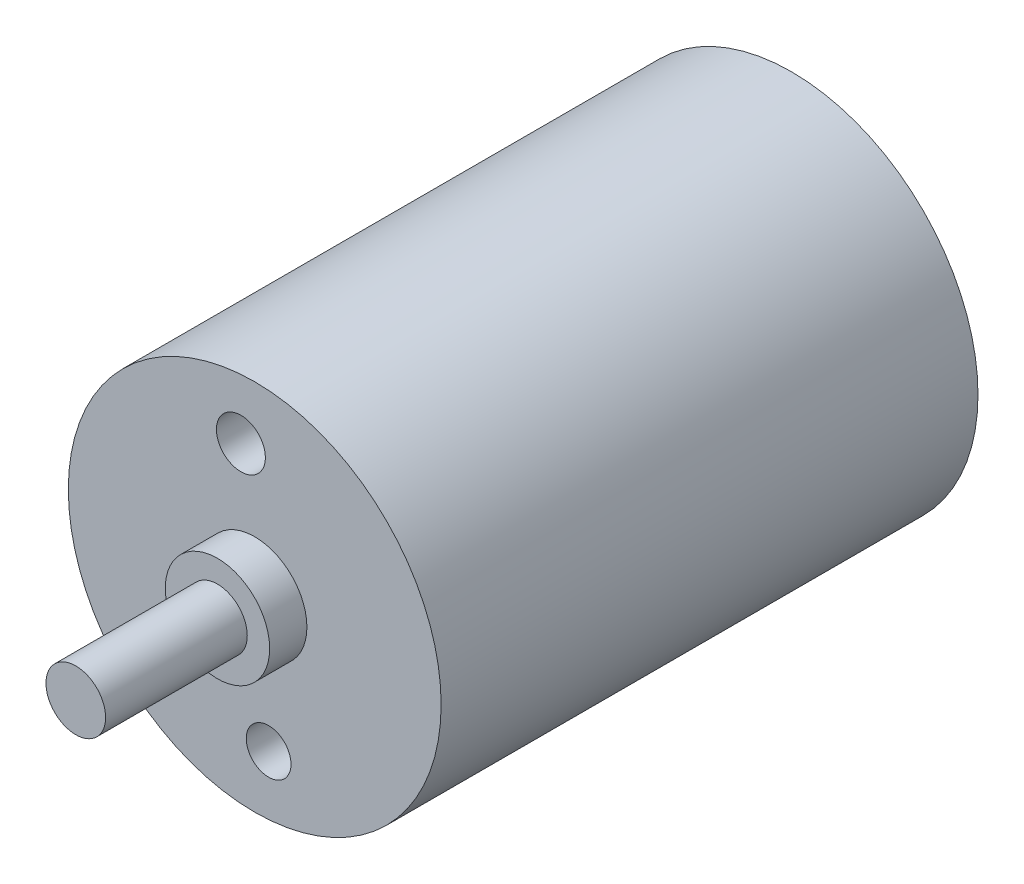
ISO-10303-21;
HEADER;
FILE_DESCRIPTION(('STEP AP214'),'2;1');
FILE_NAME('part.step','',(''),(''),'','','');
FILE_SCHEMA(('AUTOMOTIVE_DESIGN { 1 0 10303 214 1 1 1 1 }'));
ENDSEC;
DATA;
#1=APPLICATION_CONTEXT('core data for automotive mechanical design processes');
#2=APPLICATION_PROTOCOL_DEFINITION('international standard','automotive_design',2000,#1);
#3=PRODUCT_CONTEXT('',#1,'mechanical');
#4=PRODUCT('Part','Part','',(#3));
#5=PRODUCT_RELATED_PRODUCT_CATEGORY('part','',(#4));
#6=PRODUCT_DEFINITION_FORMATION('','',#4);
#7=PRODUCT_DEFINITION_CONTEXT('part definition',#1,'design');
#8=PRODUCT_DEFINITION('design','',#6,#7);
#9=PRODUCT_DEFINITION_SHAPE('','',#8);
#10=(LENGTH_UNIT() NAMED_UNIT(*) SI_UNIT(.MILLI.,.METRE.));
#11=(NAMED_UNIT(*) PLANE_ANGLE_UNIT() SI_UNIT($,.RADIAN.));
#12=(NAMED_UNIT(*) SI_UNIT($,.STERADIAN.) SOLID_ANGLE_UNIT());
#13=UNCERTAINTY_MEASURE_WITH_UNIT(LENGTH_MEASURE(1.E-05),#10,'distance_accuracy_value','');
#14=(GEOMETRIC_REPRESENTATION_CONTEXT(3) GLOBAL_UNCERTAINTY_ASSIGNED_CONTEXT((#13)) GLOBAL_UNIT_ASSIGNED_CONTEXT((#10,
#11,#12)) REPRESENTATION_CONTEXT('',''));
#15=CARTESIAN_POINT('',(0.,0.,0.));
#16=DIRECTION('',(0.,0.,1.));
#17=DIRECTION('',(1.,0.,0.));
#18=AXIS2_PLACEMENT_3D('',#15,#16,#17);
#19=CARTESIAN_POINT('',(-10.2159676414426,3.5755886745049,36.));
#20=DIRECTION('',(0.,0.,-1.));
#21=DIRECTION('',(-1.,0.,0.));
#22=AXIS2_PLACEMENT_3D('',#19,#20,#21);
#23=CYLINDRICAL_SURFACE('',#22,12.5);
#24=CARTESIAN_POINT('',(-10.2159676414426,3.5755886745049,36.));
#25=DIRECTION('',(0.,0.,1.));
#26=DIRECTION('',(1.,0.,0.));
#27=AXIS2_PLACEMENT_3D('',#24,#25,#26);
#28=CIRCLE('',#27,12.5);
#29=CARTESIAN_POINT('',(2.28403235855741,3.5755886745049,36.));
#30=VERTEX_POINT('',#29);
#31=EDGE_CURVE('E43',#30,#30,#28,.T.);
#32=ORIENTED_EDGE('',*,*,#31,.F.);
#33=EDGE_LOOP('',(#32));
#34=FACE_BOUND('',#33,.T.);
#35=CARTESIAN_POINT('',(-10.2159676414426,3.5755886745049,0.));
#36=DIRECTION('',(0.,0.,1.));
#37=DIRECTION('',(1.,0.,0.));
#38=AXIS2_PLACEMENT_3D('',#35,#36,#37);
#39=CIRCLE('',#38,12.5);
#40=CARTESIAN_POINT('',(2.28403235855741,3.5755886745049,0.));
#41=VERTEX_POINT('',#40);
#42=EDGE_CURVE('E34',#41,#41,#39,.T.);
#43=ORIENTED_EDGE('',*,*,#42,.T.);
#44=EDGE_LOOP('',(#43));
#45=FACE_BOUND('',#44,.T.);
#46=ADVANCED_FACE('F31',(#34,#45),#23,.T.);
#47=CARTESIAN_POINT('',(-10.2159676414426,3.5755886745049,36.));
#48=DIRECTION('',(0.,0.,1.));
#49=DIRECTION('',(1.,0.,0.));
#50=AXIS2_PLACEMENT_3D('',#47,#48,#49);
#51=PLANE('',#50);
#52=CARTESIAN_POINT('',(-11.1433319124449,12.0248487313897,36.));
#53=DIRECTION('',(0.,0.,1.));
#54=DIRECTION('',(1.,0.,0.));
#55=AXIS2_PLACEMENT_3D('',#52,#53,#54);
#56=CIRCLE('',#55,1.64118299360333);
#57=CARTESIAN_POINT('',(-9.5021489188416,12.0248487313897,36.));
#58=VERTEX_POINT('',#57);
#59=EDGE_CURVE('E171',#58,#58,#56,.T.);
#60=ORIENTED_EDGE('',*,*,#59,.F.);
#61=EDGE_LOOP('',(#60));
#62=FACE_BOUND('',#61,.T.);
#63=CARTESIAN_POINT('',(-9.28303431350024,-4.9244113254951,36.));
#64=DIRECTION('',(0.,0.,1.));
#65=DIRECTION('',(1.,0.,0.));
#66=AXIS2_PLACEMENT_3D('',#63,#64,#65);
#67=CIRCLE('',#66,1.5);
#68=CARTESIAN_POINT('',(-7.78303431350024,-4.9244113254951,36.));
#69=VERTEX_POINT('',#68);
#70=EDGE_CURVE('E179',#69,#69,#67,.T.);
#71=ORIENTED_EDGE('',*,*,#70,.F.);
#72=EDGE_LOOP('',(#71));
#73=FACE_BOUND('',#72,.T.);
#74=CARTESIAN_POINT('',(-10.2159676414426,3.5755886745049,36.));
#75=DIRECTION('',(0.,0.,1.));
#76=DIRECTION('',(1.,0.,0.));
#77=AXIS2_PLACEMENT_3D('',#74,#75,#76);
#78=CIRCLE('',#77,3.5);
#79=CARTESIAN_POINT('',(-6.71596764144259,3.5755886745049,36.));
#80=VERTEX_POINT('',#79);
#81=EDGE_CURVE('E38',#80,#80,#78,.T.);
#82=ORIENTED_EDGE('',*,*,#81,.F.);
#83=EDGE_LOOP('',(#82));
#84=FACE_BOUND('',#83,.T.);
#85=ORIENTED_EDGE('',*,*,#31,.T.);
#86=EDGE_LOOP('',(#85));
#87=FACE_BOUND('',#86,.T.);
#88=ADVANCED_FACE('F61',(#62,#73,#84,#87),#51,.T.);
#89=CARTESIAN_POINT('',(-10.2159676414426,3.5755886745049,0.));
#90=DIRECTION('',(0.,0.,1.));
#91=DIRECTION('',(1.,0.,0.));
#92=AXIS2_PLACEMENT_3D('',#89,#90,#91);
#93=PLANE('',#92);
#94=ORIENTED_EDGE('',*,*,#42,.F.);
#95=EDGE_LOOP('',(#94));
#96=FACE_BOUND('',#95,.T.);
#97=ADVANCED_FACE('F58',(#96),#93,.F.);
#98=CARTESIAN_POINT('',(-10.2159676414426,3.5755886745049,38.5));
#99=DIRECTION('',(0.,0.,-1.));
#100=DIRECTION('',(-1.,0.,0.));
#101=AXIS2_PLACEMENT_3D('',#98,#99,#100);
#102=CYLINDRICAL_SURFACE('',#101,3.5);
#103=CARTESIAN_POINT('',(-10.2159676414426,3.5755886745049,38.5));
#104=DIRECTION('',(0.,0.,1.));
#105=DIRECTION('',(1.,0.,0.));
#106=AXIS2_PLACEMENT_3D('',#103,#104,#105);
#107=CIRCLE('',#106,3.5);
#108=CARTESIAN_POINT('',(-6.71596764144259,3.5755886745049,38.5));
#109=VERTEX_POINT('',#108);
#110=EDGE_CURVE('E49',#109,#109,#107,.T.);
#111=ORIENTED_EDGE('',*,*,#110,.F.);
#112=EDGE_LOOP('',(#111));
#113=FACE_BOUND('',#112,.T.);
#114=ORIENTED_EDGE('',*,*,#81,.T.);
#115=EDGE_LOOP('',(#114));
#116=FACE_BOUND('',#115,.T.);
#117=ADVANCED_FACE('F60',(#113,#116),#102,.T.);
#118=CARTESIAN_POINT('',(-10.2159676414426,3.5755886745049,38.5));
#119=DIRECTION('',(0.,0.,1.));
#120=DIRECTION('',(1.,0.,0.));
#121=AXIS2_PLACEMENT_3D('',#118,#119,#120);
#122=PLANE('',#121);
#123=CARTESIAN_POINT('',(-10.2159676414426,3.5755886745049,38.5));
#124=DIRECTION('',(0.,0.,1.));
#125=DIRECTION('',(1.,0.,0.));
#126=AXIS2_PLACEMENT_3D('',#123,#124,#125);
#127=CIRCLE('',#126,2.);
#128=CARTESIAN_POINT('',(-8.21596764144259,3.5755886745049,38.5));
#129=VERTEX_POINT('',#128);
#130=EDGE_CURVE('E10',#129,#129,#127,.T.);
#131=ORIENTED_EDGE('',*,*,#130,.F.);
#132=EDGE_LOOP('',(#131));
#133=FACE_BOUND('',#132,.T.);
#134=ORIENTED_EDGE('',*,*,#110,.T.);
#135=EDGE_LOOP('',(#134));
#136=FACE_BOUND('',#135,.T.);
#137=ADVANCED_FACE('F66',(#133,#136),#122,.T.);
#138=CARTESIAN_POINT('',(-10.2159676414426,3.5755886745049,48.));
#139=DIRECTION('',(0.,0.,-1.));
#140=DIRECTION('',(-1.,0.,0.));
#141=AXIS2_PLACEMENT_3D('',#138,#139,#140);
#142=CYLINDRICAL_SURFACE('',#141,2.);
#143=CARTESIAN_POINT('',(-10.2159676414426,3.5755886745049,48.));
#144=DIRECTION('',(0.,0.,1.));
#145=DIRECTION('',(1.,0.,0.));
#146=AXIS2_PLACEMENT_3D('',#143,#144,#145);
#147=CIRCLE('',#146,2.);
#148=CARTESIAN_POINT('',(-8.21596764144259,3.5755886745049,48.));
#149=VERTEX_POINT('',#148);
#150=EDGE_CURVE('E47',#149,#149,#147,.T.);
#151=ORIENTED_EDGE('',*,*,#150,.F.);
#152=EDGE_LOOP('',(#151));
#153=FACE_BOUND('',#152,.T.);
#154=ORIENTED_EDGE('',*,*,#130,.T.);
#155=EDGE_LOOP('',(#154));
#156=FACE_BOUND('',#155,.T.);
#157=ADVANCED_FACE('F133',(#153,#156),#142,.T.);
#158=CARTESIAN_POINT('',(-10.2159676414426,3.5755886745049,48.));
#159=DIRECTION('',(0.,0.,1.));
#160=DIRECTION('',(1.,0.,0.));
#161=AXIS2_PLACEMENT_3D('',#158,#159,#160);
#162=PLANE('',#161);
#163=ORIENTED_EDGE('',*,*,#150,.T.);
#164=EDGE_LOOP('',(#163));
#165=FACE_BOUND('',#164,.T.);
#166=ADVANCED_FACE('F86',(#165),#162,.T.);
#167=CARTESIAN_POINT('',(-9.28303431350024,-4.9244113254951,31.));
#168=DIRECTION('',(0.,0.,1.));
#169=DIRECTION('',(1.,0.,0.));
#170=AXIS2_PLACEMENT_3D('',#167,#168,#169);
#171=CYLINDRICAL_SURFACE('',#170,1.5);
#172=CARTESIAN_POINT('',(-9.28303431350024,-4.9244113254951,31.));
#173=DIRECTION('',(0.,0.,1.));
#174=DIRECTION('',(1.,0.,0.));
#175=AXIS2_PLACEMENT_3D('',#172,#173,#174);
#176=CIRCLE('',#175,1.5);
#177=CARTESIAN_POINT('',(-7.78303431350024,-4.9244113254951,31.));
#178=VERTEX_POINT('',#177);
#179=EDGE_CURVE('E175',#178,#178,#176,.T.);
#180=ORIENTED_EDGE('',*,*,#179,.F.);
#181=EDGE_LOOP('',(#180));
#182=FACE_BOUND('',#181,.T.);
#183=ORIENTED_EDGE('',*,*,#70,.T.);
#184=EDGE_LOOP('',(#183));
#185=FACE_BOUND('',#184,.T.);
#186=ADVANCED_FACE('F91',(#182,#185),#171,.F.);
#187=CARTESIAN_POINT('',(-9.28303431350024,-4.9244113254951,31.));
#188=DIRECTION('',(0.,0.,1.));
#189=DIRECTION('',(1.,0.,0.));
#190=AXIS2_PLACEMENT_3D('',#187,#188,#189);
#191=PLANE('',#190);
#192=ORIENTED_EDGE('',*,*,#179,.T.);
#193=EDGE_LOOP('',(#192));
#194=FACE_BOUND('',#193,.T.);
#195=ADVANCED_FACE('F96',(#194),#191,.T.);
#196=CARTESIAN_POINT('',(-11.1433319124449,12.0248487313897,31.));
#197=DIRECTION('',(0.,0.,1.));
#198=DIRECTION('',(1.,0.,0.));
#199=AXIS2_PLACEMENT_3D('',#196,#197,#198);
#200=CYLINDRICAL_SURFACE('',#199,1.64118299360333);
#201=CARTESIAN_POINT('',(-11.1433319124449,12.0248487313897,31.));
#202=DIRECTION('',(0.,0.,1.));
#203=DIRECTION('',(1.,0.,0.));
#204=AXIS2_PLACEMENT_3D('',#201,#202,#203);
#205=CIRCLE('',#204,1.64118299360333);
#206=CARTESIAN_POINT('',(-9.5021489188416,12.0248487313897,31.));
#207=VERTEX_POINT('',#206);
#208=EDGE_CURVE('E170',#207,#207,#205,.T.);
#209=ORIENTED_EDGE('',*,*,#208,.F.);
#210=EDGE_LOOP('',(#209));
#211=FACE_BOUND('',#210,.T.);
#212=ORIENTED_EDGE('',*,*,#59,.T.);
#213=EDGE_LOOP('',(#212));
#214=FACE_BOUND('',#213,.T.);
#215=ADVANCED_FACE('F106',(#211,#214),#200,.F.);
#216=CARTESIAN_POINT('',(-11.1433319124449,12.0248487313897,31.));
#217=DIRECTION('',(0.,0.,1.));
#218=DIRECTION('',(1.,0.,0.));
#219=AXIS2_PLACEMENT_3D('',#216,#217,#218);
#220=PLANE('',#219);
#221=ORIENTED_EDGE('',*,*,#208,.T.);
#222=EDGE_LOOP('',(#221));
#223=FACE_BOUND('',#222,.T.);
#224=ADVANCED_FACE('F116',(#223),#220,.T.);
#225=CLOSED_SHELL('',(#46,#88,#97,#117,#137,#157,#166,#186,#195,#215,#224));
#226=MANIFOLD_SOLID_BREP('B2',#225);
#227=ADVANCED_BREP_SHAPE_REPRESENTATION('',(#18,#226),#14);
#228=SHAPE_DEFINITION_REPRESENTATION(#9,#227);
ENDSEC;
END-ISO-10303-21;
